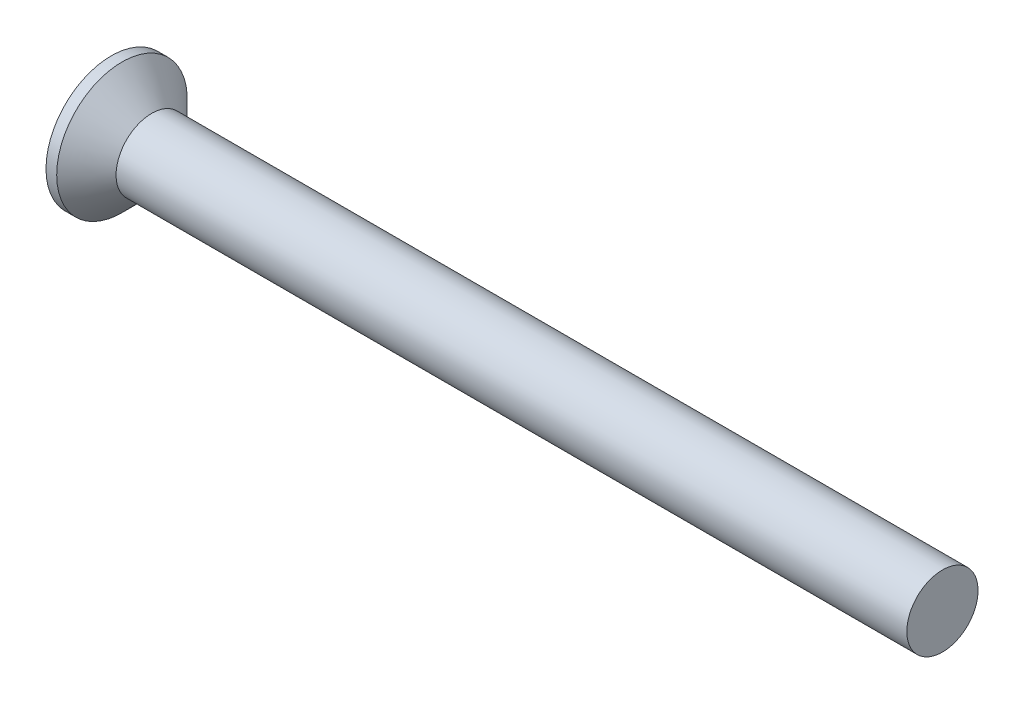
ISO-10303-21;
HEADER;
FILE_DESCRIPTION(('STEP AP214'),'2;1');
FILE_NAME('part.step','',(''),(''),'','','');
FILE_SCHEMA(('AUTOMOTIVE_DESIGN { 1 0 10303 214 1 1 1 1 }'));
ENDSEC;
DATA;
#1=APPLICATION_CONTEXT('core data for automotive mechanical design processes');
#2=APPLICATION_PROTOCOL_DEFINITION('international standard','automotive_design',2000,#1);
#3=PRODUCT_CONTEXT('',#1,'mechanical');
#4=PRODUCT('Part','Part','',(#3));
#5=PRODUCT_RELATED_PRODUCT_CATEGORY('part','',(#4));
#6=PRODUCT_DEFINITION_FORMATION('','',#4);
#7=PRODUCT_DEFINITION_CONTEXT('part definition',#1,'design');
#8=PRODUCT_DEFINITION('design','',#6,#7);
#9=PRODUCT_DEFINITION_SHAPE('','',#8);
#10=(LENGTH_UNIT() NAMED_UNIT(*) SI_UNIT(.MILLI.,.METRE.));
#11=(NAMED_UNIT(*) PLANE_ANGLE_UNIT() SI_UNIT($,.RADIAN.));
#12=(NAMED_UNIT(*) SI_UNIT($,.STERADIAN.) SOLID_ANGLE_UNIT());
#13=UNCERTAINTY_MEASURE_WITH_UNIT(LENGTH_MEASURE(1.E-05),#10,'distance_accuracy_value','');
#14=(GEOMETRIC_REPRESENTATION_CONTEXT(3) GLOBAL_UNCERTAINTY_ASSIGNED_CONTEXT((#13)) GLOBAL_UNIT_ASSIGNED_CONTEXT((#10,
#11,#12)) REPRESENTATION_CONTEXT('',''));
#15=CARTESIAN_POINT('',(0.,0.,0.));
#16=DIRECTION('',(0.,0.,1.));
#17=DIRECTION('',(1.,0.,0.));
#18=AXIS2_PLACEMENT_3D('',#15,#16,#17);
#19=CARTESIAN_POINT('',(0.,0.,0.));
#20=DIRECTION('',(-1.,0.,0.));
#21=DIRECTION('',(0.,0.,1.));
#22=AXIS2_PLACEMENT_3D('',#19,#20,#21);
#23=PLANE('',#22);
#24=CARTESIAN_POINT('',(0.,0.,0.));
#25=DIRECTION('',(-1.,0.,0.));
#26=DIRECTION('',(0.,0.,1.));
#27=AXIS2_PLACEMENT_3D('',#24,#25,#26);
#28=CIRCLE('',#27,2.75);
#29=CARTESIAN_POINT('',(0.,0.,2.75));
#30=VERTEX_POINT('',#29);
#31=EDGE_CURVE('E42',#30,#30,#28,.T.);
#32=ORIENTED_EDGE('',*,*,#31,.T.);
#33=EDGE_LOOP('',(#32));
#34=FACE_BOUND('',#33,.T.);
#35=DIRECTION('',(0.,1.,0.));
#36=VECTOR('',#35,1.);
#37=CARTESIAN_POINT('',(0.,-1.55,-0.395));
#38=LINE('',#37,#36);
#39=CARTESIAN_POINT('',(0.,-1.55,-0.395));
#40=VERTEX_POINT('',#39);
#41=CARTESIAN_POINT('',(0.,-0.394999999999999,-0.395));
#42=VERTEX_POINT('',#41);
#43=EDGE_CURVE('E103',#40,#42,#38,.T.);
#44=ORIENTED_EDGE('',*,*,#43,.T.);
#45=DIRECTION('',(0.,0.,-1.));
#46=VECTOR('',#45,1.);
#47=CARTESIAN_POINT('',(0.,-0.395000000000005,1.55));
#48=LINE('',#47,#46);
#49=CARTESIAN_POINT('',(0.,-0.394999999999995,-1.55));
#50=VERTEX_POINT('',#49);
#51=EDGE_CURVE('E83',#42,#50,#48,.T.);
#52=ORIENTED_EDGE('',*,*,#51,.T.);
#53=DIRECTION('',(0.,1.,0.));
#54=VECTOR('',#53,1.);
#55=CARTESIAN_POINT('',(0.,-0.394999999999995,-1.55));
#56=LINE('',#55,#54);
#57=CARTESIAN_POINT('',(0.,0.395000000000005,-1.55));
#58=VERTEX_POINT('',#57);
#59=EDGE_CURVE('E340',#50,#58,#56,.T.);
#60=ORIENTED_EDGE('',*,*,#59,.T.);
#61=DIRECTION('',(0.,0.,1.));
#62=VECTOR('',#61,1.);
#63=CARTESIAN_POINT('',(0.,0.395000000000005,-1.55));
#64=LINE('',#63,#62);
#65=CARTESIAN_POINT('',(0.,0.395000000000001,-0.395));
#66=VERTEX_POINT('',#65);
#67=EDGE_CURVE('E99',#58,#66,#64,.T.);
#68=ORIENTED_EDGE('',*,*,#67,.T.);
#69=CARTESIAN_POINT('',(0.,1.55,-0.395));
#70=VERTEX_POINT('',#69);
#71=EDGE_CURVE('E93',#66,#70,#38,.T.);
#72=ORIENTED_EDGE('',*,*,#71,.T.);
#73=DIRECTION('',(0.,0.,1.));
#74=VECTOR('',#73,1.);
#75=CARTESIAN_POINT('',(0.,1.55,-0.395));
#76=LINE('',#75,#74);
#77=CARTESIAN_POINT('',(0.,1.55,0.395));
#78=VERTEX_POINT('',#77);
#79=EDGE_CURVE('E96',#70,#78,#76,.T.);
#80=ORIENTED_EDGE('',*,*,#79,.T.);
#81=DIRECTION('',(0.,-1.,0.));
#82=VECTOR('',#81,1.);
#83=CARTESIAN_POINT('',(0.,1.55,0.395));
#84=LINE('',#83,#82);
#85=CARTESIAN_POINT('',(0.,0.394999999999998,0.395));
#86=VERTEX_POINT('',#85);
#87=EDGE_CURVE('E352',#78,#86,#84,.T.);
#88=ORIENTED_EDGE('',*,*,#87,.T.);
#89=CARTESIAN_POINT('',(0.,0.394999999999994,1.55));
#90=VERTEX_POINT('',#89);
#91=EDGE_CURVE('E335',#86,#90,#64,.T.);
#92=ORIENTED_EDGE('',*,*,#91,.T.);
#93=DIRECTION('',(0.,-1.,0.));
#94=VECTOR('',#93,1.);
#95=CARTESIAN_POINT('',(0.,0.394999999999994,1.55));
#96=LINE('',#95,#94);
#97=CARTESIAN_POINT('',(0.,-0.395000000000005,1.55));
#98=VERTEX_POINT('',#97);
#99=EDGE_CURVE('E321',#90,#98,#96,.T.);
#100=ORIENTED_EDGE('',*,*,#99,.T.);
#101=CARTESIAN_POINT('',(0.,-0.395000000000001,0.395));
#102=VERTEX_POINT('',#101);
#103=EDGE_CURVE('E333',#98,#102,#48,.T.);
#104=ORIENTED_EDGE('',*,*,#103,.T.);
#105=CARTESIAN_POINT('',(0.,-1.55,0.395));
#106=VERTEX_POINT('',#105);
#107=EDGE_CURVE('E109',#102,#106,#84,.T.);
#108=ORIENTED_EDGE('',*,*,#107,.T.);
#109=DIRECTION('',(0.,0.,-1.));
#110=VECTOR('',#109,1.);
#111=CARTESIAN_POINT('',(0.,-1.55,0.395));
#112=LINE('',#111,#110);
#113=EDGE_CURVE('E132',#106,#40,#112,.T.);
#114=ORIENTED_EDGE('',*,*,#113,.T.);
#115=EDGE_LOOP('',(#44,#52,#60,#68,#72,#80,#88,#92,#100,#104,#108,#114));
#116=FACE_BOUND('',#115,.T.);
#117=ADVANCED_FACE('F35',(#34,#116),#23,.T.);
#118=CARTESIAN_POINT('',(2.38373382624769,0.,0.16865988909427));
#119=DIRECTION('',(-0.0945267588569115,0.,-0.995522321125954));
#120=DIRECTION('',(-0.995522321125954,0.,0.0945267588569115));
#121=AXIS2_PLACEMENT_3D('',#118,#119,#120);
#122=PLANE('',#121);
#123=ORIENTED_EDGE('',*,*,#107,.F.);
#124=DIRECTION('',(0.991104257398676,0.0941072552097304,-0.0941072552097301));
#125=VECTOR('',#124,1.);
#126=CARTESIAN_POINT('',(2.39946475118715,-0.16716620751949,0.167166207519489));
#127=LINE('',#126,#125);
#128=CARTESIAN_POINT('',(2.08,-0.197500000000001,0.197499999999999));
#129=VERTEX_POINT('',#128);
#130=EDGE_CURVE('E127',#102,#129,#127,.T.);
#131=ORIENTED_EDGE('',*,*,#130,.T.);
#132=DIRECTION('',(0.835707904588477,0.543411029305728,-0.0793520726712617));
#133=VECTOR('',#132,1.);
#134=CARTESIAN_POINT('',(0.,-1.55,0.395));
#135=LINE('',#134,#133);
#136=EDGE_CURVE('E104',#106,#129,#135,.T.);
#137=ORIENTED_EDGE('',*,*,#136,.F.);
#138=EDGE_LOOP('',(#123,#131,#137));
#139=FACE_BOUND('',#138,.T.);
#140=ADVANCED_FACE('F155',(#139),#122,.T.);
#141=DIRECTION('',(0.835707904588477,-0.543411029305729,-0.0793520726712616));
#142=VECTOR('',#141,1.);
#143=CARTESIAN_POINT('',(0.,1.55,0.395));
#144=LINE('',#143,#142);
#145=CARTESIAN_POINT('',(2.08,0.1975,0.1975));
#146=VERTEX_POINT('',#145);
#147=EDGE_CURVE('E49',#78,#146,#144,.T.);
#148=ORIENTED_EDGE('',*,*,#147,.T.);
#149=DIRECTION('',(-0.991104257398676,0.0941072552097297,0.09410725520973));
#150=VECTOR('',#149,1.);
#151=CARTESIAN_POINT('',(2.39946475118715,0.167166207519489,0.167166207519489));
#152=LINE('',#151,#150);
#153=EDGE_CURVE('E348',#146,#86,#152,.T.);
#154=ORIENTED_EDGE('',*,*,#153,.T.);
#155=ORIENTED_EDGE('',*,*,#87,.F.);
#156=EDGE_LOOP('',(#148,#154,#155));
#157=FACE_BOUND('',#156,.T.);
#158=ADVANCED_FACE('F159',(#157),#122,.T.);
#159=CARTESIAN_POINT('',(2.38373382624769,0.,-0.16865988909427));
#160=DIRECTION('',(-0.0945267588569114,0.,0.995522321125954));
#161=DIRECTION('',(0.995522321125954,0.,0.0945267588569114));
#162=AXIS2_PLACEMENT_3D('',#159,#160,#161);
#163=PLANE('',#162);
#164=DIRECTION('',(0.835707904588477,0.543411029305729,0.0793520726712616));
#165=VECTOR('',#164,1.);
#166=CARTESIAN_POINT('',(0.,-1.55,-0.395));
#167=LINE('',#166,#165);
#168=CARTESIAN_POINT('',(2.08,-0.197499999999999,-0.197500000000001));
#169=VERTEX_POINT('',#168);
#170=EDGE_CURVE('E58',#40,#169,#167,.T.);
#171=ORIENTED_EDGE('',*,*,#170,.T.);
#172=DIRECTION('',(-0.991104257398676,-0.0941072552097297,-0.09410725520973));
#173=VECTOR('',#172,1.);
#174=CARTESIAN_POINT('',(2.39946475118715,-0.167166207519489,-0.167166207519489));
#175=LINE('',#174,#173);
#176=EDGE_CURVE('E11',#169,#42,#175,.T.);
#177=ORIENTED_EDGE('',*,*,#176,.T.);
#178=ORIENTED_EDGE('',*,*,#43,.F.);
#179=EDGE_LOOP('',(#171,#177,#178));
#180=FACE_BOUND('',#179,.T.);
#181=ADVANCED_FACE('F152',(#180),#163,.T.);
#182=ORIENTED_EDGE('',*,*,#71,.F.);
#183=DIRECTION('',(0.991104257398676,-0.0941072552097303,0.09410725520973));
#184=VECTOR('',#183,1.);
#185=CARTESIAN_POINT('',(2.39946475118715,0.16716620751949,-0.167166207519489));
#186=LINE('',#185,#184);
#187=CARTESIAN_POINT('',(2.08,0.1975,-0.1975));
#188=VERTEX_POINT('',#187);
#189=EDGE_CURVE('E112',#66,#188,#186,.T.);
#190=ORIENTED_EDGE('',*,*,#189,.T.);
#191=DIRECTION('',(0.835707904588477,-0.543411029305729,0.0793520726712616));
#192=VECTOR('',#191,1.);
#193=CARTESIAN_POINT('',(0.,1.55,-0.395));
#194=LINE('',#193,#192);
#195=EDGE_CURVE('E108',#70,#188,#194,.T.);
#196=ORIENTED_EDGE('',*,*,#195,.F.);
#197=EDGE_LOOP('',(#182,#190,#196));
#198=FACE_BOUND('',#197,.T.);
#199=ADVANCED_FACE('F111',(#198),#163,.T.);
#200=CARTESIAN_POINT('',(-6.34999999999999,0.,0.));
#201=DIRECTION('',(-1.,0.,0.));
#202=DIRECTION('',(0.,0.,1.));
#203=AXIS2_PLACEMENT_3D('',#200,#201,#202);
#204=CYLINDRICAL_SURFACE('',#203,2.75);
#205=CARTESIAN_POINT('',(0.450000000000005,0.,0.));
#206=DIRECTION('',(-1.,0.,0.));
#207=DIRECTION('',(0.,0.,1.));
#208=AXIS2_PLACEMENT_3D('',#205,#206,#207);
#209=CIRCLE('',#208,2.75);
#210=CARTESIAN_POINT('',(0.450000000000005,0.,2.75));
#211=VERTEX_POINT('',#210);
#212=EDGE_CURVE('E135',#211,#211,#209,.T.);
#213=ORIENTED_EDGE('',*,*,#212,.T.);
#214=EDGE_LOOP('',(#213));
#215=FACE_BOUND('',#214,.T.);
#216=ORIENTED_EDGE('',*,*,#31,.F.);
#217=EDGE_LOOP('',(#216));
#218=FACE_BOUND('',#217,.T.);
#219=ADVANCED_FACE('F141',(#215,#218),#204,.T.);
#220=CARTESIAN_POINT('',(0.450000000000005,0.,0.));
#221=DIRECTION('',(-1.,0.,0.));
#222=DIRECTION('',(0.,0.,1.));
#223=AXIS2_PLACEMENT_3D('',#220,#221,#222);
#224=CONICAL_SURFACE('',#223,2.75,0.78539816339745);
#225=CARTESIAN_POINT('',(1.7,0.,0.));
#226=DIRECTION('',(-1.,0.,0.));
#227=DIRECTION('',(0.,0.,1.));
#228=AXIS2_PLACEMENT_3D('',#225,#226,#227);
#229=CIRCLE('',#228,1.5);
#230=CARTESIAN_POINT('',(1.7,0.,1.5));
#231=VERTEX_POINT('',#230);
#232=EDGE_CURVE('E131',#231,#231,#229,.T.);
#233=ORIENTED_EDGE('',*,*,#232,.T.);
#234=EDGE_LOOP('',(#233));
#235=FACE_BOUND('',#234,.T.);
#236=ORIENTED_EDGE('',*,*,#212,.F.);
#237=EDGE_LOOP('',(#236));
#238=FACE_BOUND('',#237,.T.);
#239=ADVANCED_FACE('F143',(#235,#238),#224,.T.);
#240=CARTESIAN_POINT('',(-6.34999999999999,0.,0.));
#241=DIRECTION('',(-1.,0.,0.));
#242=DIRECTION('',(0.,0.,1.));
#243=AXIS2_PLACEMENT_3D('',#240,#241,#242);
#244=CYLINDRICAL_SURFACE('',#243,1.5);
#245=CARTESIAN_POINT('',(35.,0.,0.));
#246=DIRECTION('',(-1.,0.,0.));
#247=DIRECTION('',(0.,0.,1.));
#248=AXIS2_PLACEMENT_3D('',#245,#246,#247);
#249=CIRCLE('',#248,1.5);
#250=CARTESIAN_POINT('',(35.,0.,1.5));
#251=VERTEX_POINT('',#250);
#252=EDGE_CURVE('E128',#251,#251,#249,.T.);
#253=ORIENTED_EDGE('',*,*,#252,.T.);
#254=EDGE_LOOP('',(#253));
#255=FACE_BOUND('',#254,.T.);
#256=ORIENTED_EDGE('',*,*,#232,.F.);
#257=EDGE_LOOP('',(#256));
#258=FACE_BOUND('',#257,.T.);
#259=ADVANCED_FACE('F149',(#255,#258),#244,.T.);
#260=CARTESIAN_POINT('',(35.,1.5,0.));
#261=DIRECTION('',(1.,0.,0.));
#262=DIRECTION('',(0.,0.,-1.));
#263=AXIS2_PLACEMENT_3D('',#260,#261,#262);
#264=PLANE('',#263);
#265=ORIENTED_EDGE('',*,*,#252,.F.);
#266=EDGE_LOOP('',(#265));
#267=FACE_BOUND('',#266,.T.);
#268=ADVANCED_FACE('F179',(#267),#264,.T.);
#269=CARTESIAN_POINT('',(2.08,0.1975,-0.1975));
#270=DIRECTION('',(1.,0.,0.));
#271=DIRECTION('',(0.,0.,-1.));
#272=AXIS2_PLACEMENT_3D('',#269,#270,#271);
#273=PLANE('',#272);
#274=DIRECTION('',(0.,1.,0.));
#275=VECTOR('',#274,1.);
#276=CARTESIAN_POINT('',(2.08,-0.1975,-0.1975));
#277=LINE('',#276,#275);
#278=EDGE_CURVE('E123',#169,#188,#277,.T.);
#279=ORIENTED_EDGE('',*,*,#278,.F.);
#280=DIRECTION('',(0.,0.,-1.));
#281=VECTOR('',#280,1.);
#282=CARTESIAN_POINT('',(2.08,-0.1975,0.1975));
#283=LINE('',#282,#281);
#284=EDGE_CURVE('E114',#129,#169,#283,.T.);
#285=ORIENTED_EDGE('',*,*,#284,.F.);
#286=DIRECTION('',(0.,-1.,0.));
#287=VECTOR('',#286,1.);
#288=CARTESIAN_POINT('',(2.08,0.1975,0.1975));
#289=LINE('',#288,#287);
#290=EDGE_CURVE('E117',#146,#129,#289,.T.);
#291=ORIENTED_EDGE('',*,*,#290,.F.);
#292=DIRECTION('',(0.,0.,1.));
#293=VECTOR('',#292,1.);
#294=CARTESIAN_POINT('',(2.08,0.1975,-0.1975));
#295=LINE('',#294,#293);
#296=EDGE_CURVE('E121',#188,#146,#295,.T.);
#297=ORIENTED_EDGE('',*,*,#296,.F.);
#298=EDGE_LOOP('',(#279,#285,#291,#297));
#299=FACE_BOUND('',#298,.T.);
#300=ADVANCED_FACE('F176',(#299),#273,.F.);
#301=CARTESIAN_POINT('',(0.,-1.55,-0.395));
#302=DIRECTION('',(-0.54513001368185,0.838351518268576,0.));
#303=DIRECTION('',(-0.838351518268576,-0.54513001368185,0.));
#304=AXIS2_PLACEMENT_3D('',#301,#302,#303);
#305=PLANE('',#304);
#306=ORIENTED_EDGE('',*,*,#170,.F.);
#307=ORIENTED_EDGE('',*,*,#113,.F.);
#308=ORIENTED_EDGE('',*,*,#136,.T.);
#309=ORIENTED_EDGE('',*,*,#284,.T.);
#310=EDGE_LOOP('',(#306,#307,#308,#309));
#311=FACE_BOUND('',#310,.T.);
#312=ADVANCED_FACE('F168',(#311),#305,.T.);
#313=CARTESIAN_POINT('',(0.,1.55,0.395));
#314=DIRECTION('',(-0.54513001368185,-0.838351518268576,0.));
#315=DIRECTION('',(0.838351518268576,-0.54513001368185,0.));
#316=AXIS2_PLACEMENT_3D('',#313,#314,#315);
#317=PLANE('',#316);
#318=ORIENTED_EDGE('',*,*,#147,.F.);
#319=ORIENTED_EDGE('',*,*,#79,.F.);
#320=ORIENTED_EDGE('',*,*,#195,.T.);
#321=ORIENTED_EDGE('',*,*,#296,.T.);
#322=EDGE_LOOP('',(#318,#319,#320,#321));
#323=FACE_BOUND('',#322,.T.);
#324=ADVANCED_FACE('F107',(#323),#317,.T.);
#325=CARTESIAN_POINT('',(2.38373382624769,-0.16865988909427,0.));
#326=DIRECTION('',(-0.0945267588569115,0.995522321125954,0.));
#327=DIRECTION('',(-0.995522321125954,-0.0945267588569115,0.));
#328=AXIS2_PLACEMENT_3D('',#325,#326,#327);
#329=PLANE('',#328);
#330=DIRECTION('',(0.835707904588477,0.0793520726712598,0.543411029305729));
#331=VECTOR('',#330,1.);
#332=CARTESIAN_POINT('',(0.,-0.394999999999995,-1.55));
#333=LINE('',#332,#331);
#334=EDGE_CURVE('E342',#50,#169,#333,.T.);
#335=ORIENTED_EDGE('',*,*,#334,.F.);
#336=ORIENTED_EDGE('',*,*,#51,.F.);
#337=ORIENTED_EDGE('',*,*,#176,.F.);
#338=EDGE_LOOP('',(#335,#336,#337));
#339=FACE_BOUND('',#338,.T.);
#340=ADVANCED_FACE('F175',(#339),#329,.T.);
#341=CARTESIAN_POINT('',(2.38373382624769,0.16865988909427,0.));
#342=DIRECTION('',(-0.0945267588569114,-0.995522321125954,0.));
#343=DIRECTION('',(0.995522321125954,-0.0945267588569114,0.));
#344=AXIS2_PLACEMENT_3D('',#341,#342,#343);
#345=PLANE('',#344);
#346=ORIENTED_EDGE('',*,*,#67,.F.);
#347=DIRECTION('',(0.835707904588477,-0.0793520726712635,0.543411029305728));
#348=VECTOR('',#347,1.);
#349=CARTESIAN_POINT('',(0.,0.395000000000005,-1.55));
#350=LINE('',#349,#348);
#351=EDGE_CURVE('E74',#58,#188,#350,.T.);
#352=ORIENTED_EDGE('',*,*,#351,.T.);
#353=ORIENTED_EDGE('',*,*,#189,.F.);
#354=EDGE_LOOP('',(#346,#352,#353));
#355=FACE_BOUND('',#354,.T.);
#356=ADVANCED_FACE('F219',(#355),#345,.T.);
#357=CARTESIAN_POINT('',(0.,0.395000000000005,-1.55));
#358=DIRECTION('',(-0.54513001368185,0.,0.838351518268576));
#359=DIRECTION('',(-0.838351518268576,0.,-0.54513001368185));
#360=AXIS2_PLACEMENT_3D('',#357,#358,#359);
#361=PLANE('',#360);
#362=ORIENTED_EDGE('',*,*,#351,.F.);
#363=ORIENTED_EDGE('',*,*,#59,.F.);
#364=ORIENTED_EDGE('',*,*,#334,.T.);
#365=ORIENTED_EDGE('',*,*,#278,.T.);
#366=EDGE_LOOP('',(#362,#363,#364,#365));
#367=FACE_BOUND('',#366,.T.);
#368=ADVANCED_FACE('F227',(#367),#361,.T.);
#369=ORIENTED_EDGE('',*,*,#103,.F.);
#370=DIRECTION('',(0.835707904588477,0.0793520726712635,-0.543411029305728));
#371=VECTOR('',#370,1.);
#372=CARTESIAN_POINT('',(0.,-0.395000000000005,1.55));
#373=LINE('',#372,#371);
#374=EDGE_CURVE('E318',#98,#129,#373,.T.);
#375=ORIENTED_EDGE('',*,*,#374,.T.);
#376=ORIENTED_EDGE('',*,*,#130,.F.);
#377=EDGE_LOOP('',(#369,#375,#376));
#378=FACE_BOUND('',#377,.T.);
#379=ADVANCED_FACE('F221',(#378),#329,.T.);
#380=DIRECTION('',(0.835707904588477,-0.0793520726712597,-0.543411029305729));
#381=VECTOR('',#380,1.);
#382=CARTESIAN_POINT('',(0.,0.394999999999994,1.55));
#383=LINE('',#382,#381);
#384=EDGE_CURVE('E329',#90,#146,#383,.T.);
#385=ORIENTED_EDGE('',*,*,#384,.F.);
#386=ORIENTED_EDGE('',*,*,#91,.F.);
#387=ORIENTED_EDGE('',*,*,#153,.F.);
#388=EDGE_LOOP('',(#385,#386,#387));
#389=FACE_BOUND('',#388,.T.);
#390=ADVANCED_FACE('F229',(#389),#345,.T.);
#391=CARTESIAN_POINT('',(0.,-0.395000000000005,1.55));
#392=DIRECTION('',(-0.54513001368185,0.,-0.838351518268576));
#393=DIRECTION('',(0.838351518268576,0.,-0.54513001368185));
#394=AXIS2_PLACEMENT_3D('',#391,#392,#393);
#395=PLANE('',#394);
#396=ORIENTED_EDGE('',*,*,#374,.F.);
#397=ORIENTED_EDGE('',*,*,#99,.F.);
#398=ORIENTED_EDGE('',*,*,#384,.T.);
#399=ORIENTED_EDGE('',*,*,#290,.T.);
#400=EDGE_LOOP('',(#396,#397,#398,#399));
#401=FACE_BOUND('',#400,.T.);
#402=ADVANCED_FACE('F248',(#401),#395,.T.);
#403=CLOSED_SHELL('',(#117,#140,#158,#181,#199,#219,#239,#259,#268,#300,#312,#324,#340,#356,
#368,#379,#390,#402));
#404=MANIFOLD_SOLID_BREP('B2',#403);
#405=ADVANCED_BREP_SHAPE_REPRESENTATION('',(#18,#404),#14);
#406=SHAPE_DEFINITION_REPRESENTATION(#9,#405);
ENDSEC;
END-ISO-10303-21;
